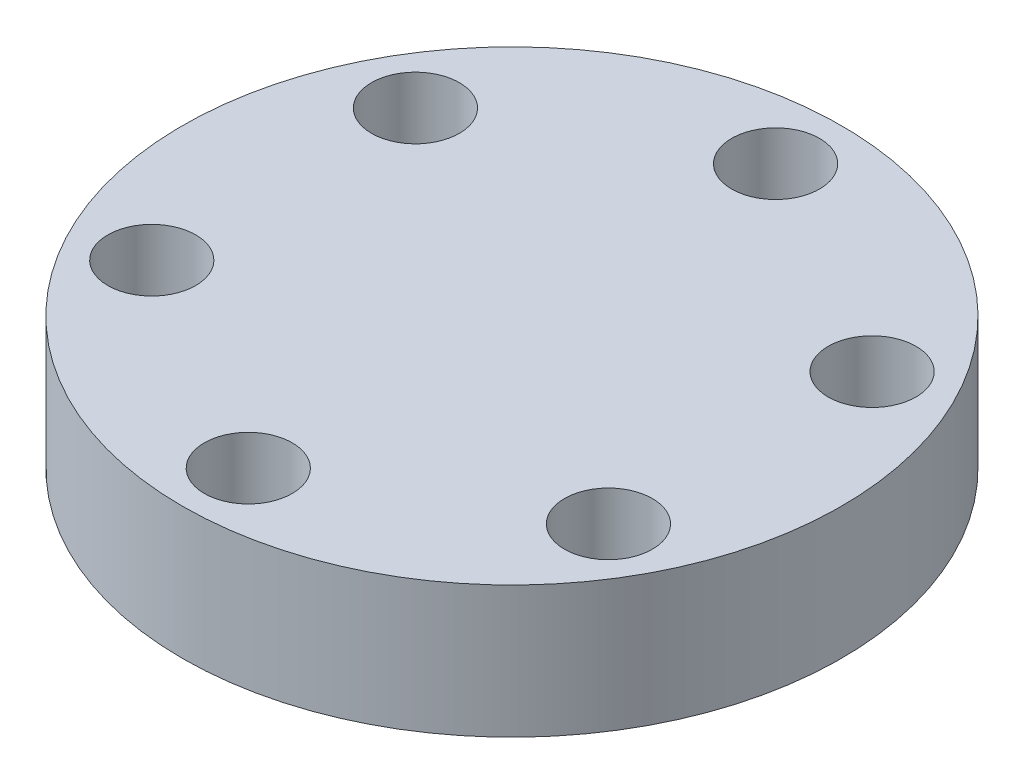
ISO-10303-21;
HEADER;
FILE_DESCRIPTION(('STEP AP214'),'2;1');
FILE_NAME('part.step','',(''),(''),'','','');
FILE_SCHEMA(('AUTOMOTIVE_DESIGN { 1 0 10303 214 1 1 1 1 }'));
ENDSEC;
DATA;
#1=APPLICATION_CONTEXT('core data for automotive mechanical design processes');
#2=APPLICATION_PROTOCOL_DEFINITION('international standard','automotive_design',2000,#1);
#3=PRODUCT_CONTEXT('',#1,'mechanical');
#4=PRODUCT('Part','Part','',(#3));
#5=PRODUCT_RELATED_PRODUCT_CATEGORY('part','',(#4));
#6=PRODUCT_DEFINITION_FORMATION('','',#4);
#7=PRODUCT_DEFINITION_CONTEXT('part definition',#1,'design');
#8=PRODUCT_DEFINITION('design','',#6,#7);
#9=PRODUCT_DEFINITION_SHAPE('','',#8);
#10=(LENGTH_UNIT() NAMED_UNIT(*) SI_UNIT(.MILLI.,.METRE.));
#11=(NAMED_UNIT(*) PLANE_ANGLE_UNIT() SI_UNIT($,.RADIAN.));
#12=(NAMED_UNIT(*) SI_UNIT($,.STERADIAN.) SOLID_ANGLE_UNIT());
#13=UNCERTAINTY_MEASURE_WITH_UNIT(LENGTH_MEASURE(1.E-05),#10,'distance_accuracy_value','');
#14=(GEOMETRIC_REPRESENTATION_CONTEXT(3) GLOBAL_UNCERTAINTY_ASSIGNED_CONTEXT((#13)) GLOBAL_UNIT_ASSIGNED_CONTEXT((#10,
#11,#12)) REPRESENTATION_CONTEXT('',''));
#15=CARTESIAN_POINT('',(0.,0.,0.));
#16=DIRECTION('',(0.,0.,1.));
#17=DIRECTION('',(1.,0.,0.));
#18=AXIS2_PLACEMENT_3D('',#15,#16,#17);
#19=CARTESIAN_POINT('',(0.,36.,0.));
#20=DIRECTION('',(0.,1.,0.));
#21=DIRECTION('',(0.,0.,1.));
#22=AXIS2_PLACEMENT_3D('',#19,#20,#21);
#23=PLANE('',#22);
#24=CARTESIAN_POINT('',(10.3923048454132,36.,-6.00000000000005));
#25=DIRECTION('',(0.,1.,0.));
#26=DIRECTION('',(0.,0.,1.));
#27=AXIS2_PLACEMENT_3D('',#24,#25,#26);
#28=CIRCLE('',#27,2.);
#29=CARTESIAN_POINT('',(10.3923048454132,36.,-4.00000000000005));
#30=VERTEX_POINT('',#29);
#31=EDGE_CURVE('E73',#30,#30,#28,.T.);
#32=ORIENTED_EDGE('',*,*,#31,.F.);
#33=EDGE_LOOP('',(#32));
#34=FACE_BOUND('',#33,.T.);
#35=CARTESIAN_POINT('',(0.,36.,12.));
#36=DIRECTION('',(0.,1.,0.));
#37=DIRECTION('',(0.,0.,1.));
#38=AXIS2_PLACEMENT_3D('',#35,#36,#37);
#39=CIRCLE('',#38,2.);
#40=CARTESIAN_POINT('',(0.,36.,14.));
#41=VERTEX_POINT('',#40);
#42=EDGE_CURVE('E61',#41,#41,#39,.T.);
#43=ORIENTED_EDGE('',*,*,#42,.F.);
#44=EDGE_LOOP('',(#43));
#45=FACE_BOUND('',#44,.T.);
#46=CARTESIAN_POINT('',(-10.3923048454133,36.,-5.9999999999999));
#47=DIRECTION('',(0.,1.,0.));
#48=DIRECTION('',(0.,0.,1.));
#49=AXIS2_PLACEMENT_3D('',#46,#47,#48);
#50=CIRCLE('',#49,2.);
#51=CARTESIAN_POINT('',(-10.3923048454133,36.,-3.99999999999991));
#52=VERTEX_POINT('',#51);
#53=EDGE_CURVE('E50',#52,#52,#50,.T.);
#54=ORIENTED_EDGE('',*,*,#53,.F.);
#55=EDGE_LOOP('',(#54));
#56=FACE_BOUND('',#55,.T.);
#57=CARTESIAN_POINT('',(0.,36.,0.));
#58=DIRECTION('',(0.,1.,0.));
#59=DIRECTION('',(0.,0.,1.));
#60=AXIS2_PLACEMENT_3D('',#57,#58,#59);
#61=CIRCLE('',#60,15.);
#62=CARTESIAN_POINT('',(0.,36.,15.));
#63=VERTEX_POINT('',#62);
#64=EDGE_CURVE('E10',#63,#63,#61,.T.);
#65=ORIENTED_EDGE('',*,*,#64,.T.);
#66=EDGE_LOOP('',(#65));
#67=FACE_BOUND('',#66,.T.);
#68=CARTESIAN_POINT('',(-10.3923048454132,36.,6.00000000000012));
#69=DIRECTION('',(0.,1.,0.));
#70=DIRECTION('',(0.,0.,1.));
#71=AXIS2_PLACEMENT_3D('',#68,#69,#70);
#72=CIRCLE('',#71,2.);
#73=CARTESIAN_POINT('',(-10.3923048454132,36.,8.00000000000012));
#74=VERTEX_POINT('',#73);
#75=EDGE_CURVE('E55',#74,#74,#72,.T.);
#76=ORIENTED_EDGE('',*,*,#75,.F.);
#77=EDGE_LOOP('',(#76));
#78=FACE_BOUND('',#77,.T.);
#79=CARTESIAN_POINT('',(10.3923048454133,36.,5.99999999999998));
#80=DIRECTION('',(0.,1.,0.));
#81=DIRECTION('',(0.,0.,1.));
#82=AXIS2_PLACEMENT_3D('',#79,#80,#81);
#83=CIRCLE('',#82,2.);
#84=CARTESIAN_POINT('',(10.3923048454133,36.,7.99999999999997));
#85=VERTEX_POINT('',#84);
#86=EDGE_CURVE('E67',#85,#85,#83,.T.);
#87=ORIENTED_EDGE('',*,*,#86,.F.);
#88=EDGE_LOOP('',(#87));
#89=FACE_BOUND('',#88,.T.);
#90=CARTESIAN_POINT('',(0.,36.,-12.));
#91=DIRECTION('',(0.,1.,0.));
#92=DIRECTION('',(0.,0.,1.));
#93=AXIS2_PLACEMENT_3D('',#90,#91,#92);
#94=CIRCLE('',#93,2.);
#95=CARTESIAN_POINT('',(0.,36.,-10.));
#96=VERTEX_POINT('',#95);
#97=EDGE_CURVE('E79',#96,#96,#94,.T.);
#98=ORIENTED_EDGE('',*,*,#97,.F.);
#99=EDGE_LOOP('',(#98));
#100=FACE_BOUND('',#99,.T.);
#101=ADVANCED_FACE('F39',(#34,#45,#56,#67,#78,#89,#100),#23,.T.);
#102=CARTESIAN_POINT('',(0.,30.,0.));
#103=DIRECTION('',(0.,1.,0.));
#104=DIRECTION('',(0.,0.,1.));
#105=AXIS2_PLACEMENT_3D('',#102,#103,#104);
#106=PLANE('',#105);
#107=CARTESIAN_POINT('',(0.,30.,0.));
#108=DIRECTION('',(0.,1.,0.));
#109=DIRECTION('',(0.,0.,1.));
#110=AXIS2_PLACEMENT_3D('',#107,#108,#109);
#111=CIRCLE('',#110,15.);
#112=CARTESIAN_POINT('',(0.,30.,15.));
#113=VERTEX_POINT('',#112);
#114=EDGE_CURVE('E43',#113,#113,#111,.T.);
#115=ORIENTED_EDGE('',*,*,#114,.F.);
#116=EDGE_LOOP('',(#115));
#117=FACE_BOUND('',#116,.T.);
#118=CARTESIAN_POINT('',(-10.3923048454133,30.,-5.9999999999999));
#119=DIRECTION('',(0.,1.,0.));
#120=DIRECTION('',(0.,0.,1.));
#121=AXIS2_PLACEMENT_3D('',#118,#119,#120);
#122=CIRCLE('',#121,2.);
#123=CARTESIAN_POINT('',(-10.3923048454133,30.,-3.99999999999991));
#124=VERTEX_POINT('',#123);
#125=EDGE_CURVE('E52',#124,#124,#122,.T.);
#126=ORIENTED_EDGE('',*,*,#125,.T.);
#127=EDGE_LOOP('',(#126));
#128=FACE_BOUND('',#127,.T.);
#129=CARTESIAN_POINT('',(-10.3923048454132,30.,6.00000000000012));
#130=DIRECTION('',(0.,1.,0.));
#131=DIRECTION('',(0.,0.,1.));
#132=AXIS2_PLACEMENT_3D('',#129,#130,#131);
#133=CIRCLE('',#132,2.);
#134=CARTESIAN_POINT('',(-10.3923048454132,30.,8.00000000000012));
#135=VERTEX_POINT('',#134);
#136=EDGE_CURVE('E58',#135,#135,#133,.T.);
#137=ORIENTED_EDGE('',*,*,#136,.T.);
#138=EDGE_LOOP('',(#137));
#139=FACE_BOUND('',#138,.T.);
#140=CARTESIAN_POINT('',(0.,30.,12.));
#141=DIRECTION('',(0.,1.,0.));
#142=DIRECTION('',(0.,0.,1.));
#143=AXIS2_PLACEMENT_3D('',#140,#141,#142);
#144=CIRCLE('',#143,2.);
#145=CARTESIAN_POINT('',(0.,30.,14.));
#146=VERTEX_POINT('',#145);
#147=EDGE_CURVE('E64',#146,#146,#144,.T.);
#148=ORIENTED_EDGE('',*,*,#147,.T.);
#149=EDGE_LOOP('',(#148));
#150=FACE_BOUND('',#149,.T.);
#151=CARTESIAN_POINT('',(10.3923048454133,30.,5.99999999999998));
#152=DIRECTION('',(0.,1.,0.));
#153=DIRECTION('',(0.,0.,1.));
#154=AXIS2_PLACEMENT_3D('',#151,#152,#153);
#155=CIRCLE('',#154,2.);
#156=CARTESIAN_POINT('',(10.3923048454133,30.,7.99999999999997));
#157=VERTEX_POINT('',#156);
#158=EDGE_CURVE('E70',#157,#157,#155,.T.);
#159=ORIENTED_EDGE('',*,*,#158,.T.);
#160=EDGE_LOOP('',(#159));
#161=FACE_BOUND('',#160,.T.);
#162=CARTESIAN_POINT('',(10.3923048454132,30.,-6.00000000000005));
#163=DIRECTION('',(0.,1.,0.));
#164=DIRECTION('',(0.,0.,1.));
#165=AXIS2_PLACEMENT_3D('',#162,#163,#164);
#166=CIRCLE('',#165,2.);
#167=CARTESIAN_POINT('',(10.3923048454132,30.,-4.00000000000005));
#168=VERTEX_POINT('',#167);
#169=EDGE_CURVE('E76',#168,#168,#166,.T.);
#170=ORIENTED_EDGE('',*,*,#169,.T.);
#171=EDGE_LOOP('',(#170));
#172=FACE_BOUND('',#171,.T.);
#173=CARTESIAN_POINT('',(0.,30.,-12.));
#174=DIRECTION('',(0.,1.,0.));
#175=DIRECTION('',(0.,0.,1.));
#176=AXIS2_PLACEMENT_3D('',#173,#174,#175);
#177=CIRCLE('',#176,2.);
#178=CARTESIAN_POINT('',(0.,30.,-10.));
#179=VERTEX_POINT('',#178);
#180=EDGE_CURVE('E82',#179,#179,#177,.T.);
#181=ORIENTED_EDGE('',*,*,#180,.T.);
#182=EDGE_LOOP('',(#181));
#183=FACE_BOUND('',#182,.T.);
#184=ADVANCED_FACE('F92',(#117,#128,#139,#150,#161,#172,#183),#106,.F.);
#185=CARTESIAN_POINT('',(0.,36.,0.));
#186=DIRECTION('',(0.,-1.,0.));
#187=DIRECTION('',(0.,0.,-1.));
#188=AXIS2_PLACEMENT_3D('',#185,#186,#187);
#189=CYLINDRICAL_SURFACE('',#188,15.);
#190=ORIENTED_EDGE('',*,*,#64,.F.);
#191=EDGE_LOOP('',(#190));
#192=FACE_BOUND('',#191,.T.);
#193=ORIENTED_EDGE('',*,*,#114,.T.);
#194=EDGE_LOOP('',(#193));
#195=FACE_BOUND('',#194,.T.);
#196=ADVANCED_FACE('F41',(#192,#195),#189,.T.);
#197=CARTESIAN_POINT('',(-10.3923048454133,36.,-5.9999999999999));
#198=DIRECTION('',(0.,-1.,0.));
#199=DIRECTION('',(0.,0.,-1.));
#200=AXIS2_PLACEMENT_3D('',#197,#198,#199);
#201=CYLINDRICAL_SURFACE('',#200,2.);
#202=ORIENTED_EDGE('',*,*,#53,.T.);
#203=EDGE_LOOP('',(#202));
#204=FACE_BOUND('',#203,.T.);
#205=ORIENTED_EDGE('',*,*,#125,.F.);
#206=EDGE_LOOP('',(#205));
#207=FACE_BOUND('',#206,.T.);
#208=ADVANCED_FACE('F102',(#204,#207),#201,.F.);
#209=CARTESIAN_POINT('',(-10.3923048454132,36.,6.00000000000012));
#210=DIRECTION('',(0.,-1.,0.));
#211=DIRECTION('',(0.,0.,-1.));
#212=AXIS2_PLACEMENT_3D('',#209,#210,#211);
#213=CYLINDRICAL_SURFACE('',#212,2.);
#214=ORIENTED_EDGE('',*,*,#75,.T.);
#215=EDGE_LOOP('',(#214));
#216=FACE_BOUND('',#215,.T.);
#217=ORIENTED_EDGE('',*,*,#136,.F.);
#218=EDGE_LOOP('',(#217));
#219=FACE_BOUND('',#218,.T.);
#220=ADVANCED_FACE('F105',(#216,#219),#213,.F.);
#221=CARTESIAN_POINT('',(0.,36.,12.));
#222=DIRECTION('',(0.,-1.,0.));
#223=DIRECTION('',(0.,0.,-1.));
#224=AXIS2_PLACEMENT_3D('',#221,#222,#223);
#225=CYLINDRICAL_SURFACE('',#224,2.);
#226=ORIENTED_EDGE('',*,*,#42,.T.);
#227=EDGE_LOOP('',(#226));
#228=FACE_BOUND('',#227,.T.);
#229=ORIENTED_EDGE('',*,*,#147,.F.);
#230=EDGE_LOOP('',(#229));
#231=FACE_BOUND('',#230,.T.);
#232=ADVANCED_FACE('F109',(#228,#231),#225,.F.);
#233=CARTESIAN_POINT('',(10.3923048454133,36.,5.99999999999998));
#234=DIRECTION('',(0.,-1.,0.));
#235=DIRECTION('',(0.,0.,-1.));
#236=AXIS2_PLACEMENT_3D('',#233,#234,#235);
#237=CYLINDRICAL_SURFACE('',#236,2.);
#238=ORIENTED_EDGE('',*,*,#86,.T.);
#239=EDGE_LOOP('',(#238));
#240=FACE_BOUND('',#239,.T.);
#241=ORIENTED_EDGE('',*,*,#158,.F.);
#242=EDGE_LOOP('',(#241));
#243=FACE_BOUND('',#242,.T.);
#244=ADVANCED_FACE('F113',(#240,#243),#237,.F.);
#245=CARTESIAN_POINT('',(10.3923048454132,36.,-6.00000000000005));
#246=DIRECTION('',(0.,-1.,0.));
#247=DIRECTION('',(0.,0.,-1.));
#248=AXIS2_PLACEMENT_3D('',#245,#246,#247);
#249=CYLINDRICAL_SURFACE('',#248,2.);
#250=ORIENTED_EDGE('',*,*,#31,.T.);
#251=EDGE_LOOP('',(#250));
#252=FACE_BOUND('',#251,.T.);
#253=ORIENTED_EDGE('',*,*,#169,.F.);
#254=EDGE_LOOP('',(#253));
#255=FACE_BOUND('',#254,.T.);
#256=ADVANCED_FACE('F117',(#252,#255),#249,.F.);
#257=CARTESIAN_POINT('',(0.,36.,-12.));
#258=DIRECTION('',(0.,-1.,0.));
#259=DIRECTION('',(0.,0.,-1.));
#260=AXIS2_PLACEMENT_3D('',#257,#258,#259);
#261=CYLINDRICAL_SURFACE('',#260,2.);
#262=ORIENTED_EDGE('',*,*,#97,.T.);
#263=EDGE_LOOP('',(#262));
#264=FACE_BOUND('',#263,.T.);
#265=ORIENTED_EDGE('',*,*,#180,.F.);
#266=EDGE_LOOP('',(#265));
#267=FACE_BOUND('',#266,.T.);
#268=ADVANCED_FACE('F88',(#264,#267),#261,.F.);
#269=CLOSED_SHELL('',(#101,#184,#196,#208,#220,#232,#244,#256,#268));
#270=MANIFOLD_SOLID_BREP('B2',#269);
#271=ADVANCED_BREP_SHAPE_REPRESENTATION('',(#18,#270),#14);
#272=SHAPE_DEFINITION_REPRESENTATION(#9,#271);
ENDSEC;
END-ISO-10303-21;
